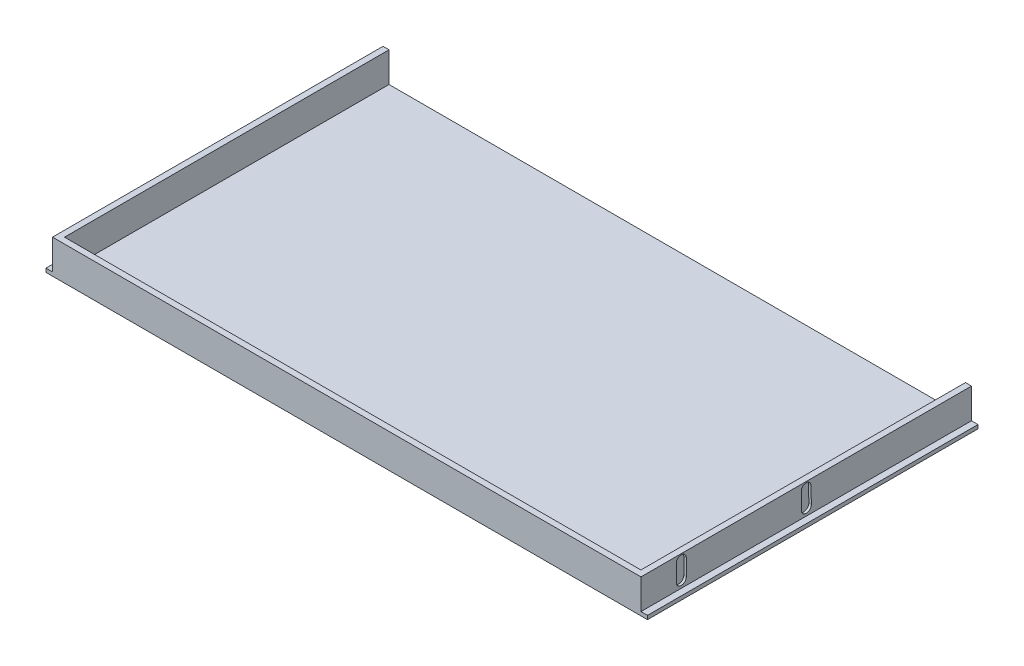
ISO-10303-21;
HEADER;
FILE_DESCRIPTION(('STEP AP214'),'2;1');
FILE_NAME('part.step','',(''),(''),'','','');
FILE_SCHEMA(('AUTOMOTIVE_DESIGN { 1 0 10303 214 1 1 1 1 }'));
ENDSEC;
DATA;
#1=APPLICATION_CONTEXT('core data for automotive mechanical design processes');
#2=APPLICATION_PROTOCOL_DEFINITION('international standard','automotive_design',2000,#1);
#3=PRODUCT_CONTEXT('',#1,'mechanical');
#4=PRODUCT('Part','Part','',(#3));
#5=PRODUCT_RELATED_PRODUCT_CATEGORY('part','',(#4));
#6=PRODUCT_DEFINITION_FORMATION('','',#4);
#7=PRODUCT_DEFINITION_CONTEXT('part definition',#1,'design');
#8=PRODUCT_DEFINITION('design','',#6,#7);
#9=PRODUCT_DEFINITION_SHAPE('','',#8);
#10=(LENGTH_UNIT() NAMED_UNIT(*) SI_UNIT(.MILLI.,.METRE.));
#11=(NAMED_UNIT(*) PLANE_ANGLE_UNIT() SI_UNIT($,.RADIAN.));
#12=(NAMED_UNIT(*) SI_UNIT($,.STERADIAN.) SOLID_ANGLE_UNIT());
#13=UNCERTAINTY_MEASURE_WITH_UNIT(LENGTH_MEASURE(1.E-05),#10,'distance_accuracy_value','');
#14=(GEOMETRIC_REPRESENTATION_CONTEXT(3) GLOBAL_UNCERTAINTY_ASSIGNED_CONTEXT((#13)) GLOBAL_UNIT_ASSIGNED_CONTEXT((#10,
#11,#12)) REPRESENTATION_CONTEXT('',''));
#15=CARTESIAN_POINT('',(0.,0.,0.));
#16=DIRECTION('',(0.,0.,1.));
#17=DIRECTION('',(1.,0.,0.));
#18=AXIS2_PLACEMENT_3D('',#15,#16,#17);
#19=CARTESIAN_POINT('',(-98.176553254438,21.,77.3984467455621));
#20=DIRECTION('',(1.,0.,0.));
#21=DIRECTION('',(0.,0.,-1.));
#22=AXIS2_PLACEMENT_3D('',#19,#20,#21);
#23=PLANE('',#22);
#24=DIRECTION('',(0.,-1.,0.));
#25=VECTOR('',#24,1.);
#26=CARTESIAN_POINT('',(-98.176553254438,21.,77.3984467455621));
#27=LINE('',#26,#25);
#28=CARTESIAN_POINT('',(-98.176553254438,1.5,77.3984467455621));
#29=VERTEX_POINT('',#28);
#30=CARTESIAN_POINT('',(-98.176553254438,0.,77.3984467455621));
#31=VERTEX_POINT('',#30);
#32=EDGE_CURVE('E42',#29,#31,#27,.T.);
#33=ORIENTED_EDGE('',*,*,#32,.F.);
#34=DIRECTION('',(0.,0.,1.));
#35=VECTOR('',#34,1.);
#36=CARTESIAN_POINT('',(-98.176553254438,1.5,77.3984467455621));
#37=LINE('',#36,#35);
#38=CARTESIAN_POINT('',(-98.176553254438,1.5,-54.4815532544379));
#39=VERTEX_POINT('',#38);
#40=EDGE_CURVE('E383',#39,#29,#37,.T.);
#41=ORIENTED_EDGE('',*,*,#40,.F.);
#42=DIRECTION('',(0.,-1.,0.));
#43=VECTOR('',#42,1.);
#44=CARTESIAN_POINT('',(-98.176553254438,21.,-54.4815532544379));
#45=LINE('',#44,#43);
#46=CARTESIAN_POINT('',(-98.176553254438,0.,-54.4815532544379));
#47=VERTEX_POINT('',#46);
#48=EDGE_CURVE('E419',#39,#47,#45,.T.);
#49=ORIENTED_EDGE('',*,*,#48,.T.);
#50=DIRECTION('',(0.,0.,1.));
#51=VECTOR('',#50,1.);
#52=CARTESIAN_POINT('',(-98.176553254438,0.,77.3984467455621));
#53=LINE('',#52,#51);
#54=EDGE_CURVE('E421',#47,#31,#53,.T.);
#55=ORIENTED_EDGE('',*,*,#54,.T.);
#56=EDGE_LOOP('',(#33,#41,#49,#55));
#57=FACE_BOUND('',#56,.T.);
#58=ADVANCED_FACE('F35',(#57),#23,.F.);
#59=CARTESIAN_POINT('',(-98.176553254438,21.,77.3984467455621));
#60=DIRECTION('',(0.,0.,-1.));
#61=DIRECTION('',(-1.,0.,0.));
#62=AXIS2_PLACEMENT_3D('',#59,#60,#61);
#63=PLANE('',#62);
#64=DIRECTION('',(1.,0.,0.));
#65=VECTOR('',#64,1.);
#66=CARTESIAN_POINT('',(139.223446745562,1.5,77.3984467455622));
#67=LINE('',#66,#65);
#68=CARTESIAN_POINT('',(139.223446745562,1.5,77.3984467455622));
#69=VERTEX_POINT('',#68);
#70=CARTESIAN_POINT('',(141.823446745562,1.5,77.3984467455622));
#71=VERTEX_POINT('',#70);
#72=EDGE_CURVE('E366',#69,#71,#67,.T.);
#73=ORIENTED_EDGE('',*,*,#72,.F.);
#74=DIRECTION('',(0.,1.,0.));
#75=VECTOR('',#74,1.);
#76=CARTESIAN_POINT('',(139.223446745562,1.5,77.3984467455622));
#77=LINE('',#76,#75);
#78=CARTESIAN_POINT('',(139.223446745562,13.5,77.3984467455622));
#79=VERTEX_POINT('',#78);
#80=EDGE_CURVE('E373',#69,#79,#77,.T.);
#81=ORIENTED_EDGE('',*,*,#80,.T.);
#82=DIRECTION('',(-1.,0.,0.));
#83=VECTOR('',#82,1.);
#84=CARTESIAN_POINT('',(-98.176553254438,13.5,77.3984467455621));
#85=LINE('',#84,#83);
#86=CARTESIAN_POINT('',(-95.576553254438,13.5,77.3984467455621));
#87=VERTEX_POINT('',#86);
#88=EDGE_CURVE('E394',#79,#87,#85,.T.);
#89=ORIENTED_EDGE('',*,*,#88,.T.);
#90=DIRECTION('',(0.,1.,0.));
#91=VECTOR('',#90,1.);
#92=CARTESIAN_POINT('',(-95.576553254438,1.5,77.3984467455621));
#93=LINE('',#92,#91);
#94=CARTESIAN_POINT('',(-95.576553254438,1.5,77.3984467455621));
#95=VERTEX_POINT('',#94);
#96=EDGE_CURVE('E372',#95,#87,#93,.T.);
#97=ORIENTED_EDGE('',*,*,#96,.F.);
#98=DIRECTION('',(1.,0.,0.));
#99=VECTOR('',#98,1.);
#100=CARTESIAN_POINT('',(-95.576553254438,1.5,77.3984467455621));
#101=LINE('',#100,#99);
#102=EDGE_CURVE('E385',#29,#95,#101,.T.);
#103=ORIENTED_EDGE('',*,*,#102,.F.);
#104=ORIENTED_EDGE('',*,*,#32,.T.);
#105=DIRECTION('',(1.,0.,0.));
#106=VECTOR('',#105,1.);
#107=CARTESIAN_POINT('',(-98.176553254438,0.,77.3984467455621));
#108=LINE('',#107,#106);
#109=CARTESIAN_POINT('',(141.823446745562,0.,77.3984467455622));
#110=VERTEX_POINT('',#109);
#111=EDGE_CURVE('E424',#31,#110,#108,.T.);
#112=ORIENTED_EDGE('',*,*,#111,.T.);
#113=DIRECTION('',(0.,-1.,0.));
#114=VECTOR('',#113,1.);
#115=CARTESIAN_POINT('',(141.823446745562,21.,77.3984467455622));
#116=LINE('',#115,#114);
#117=EDGE_CURVE('E430',#71,#110,#116,.T.);
#118=ORIENTED_EDGE('',*,*,#117,.F.);
#119=EDGE_LOOP('',(#73,#81,#89,#97,#103,#104,#112,#118));
#120=FACE_BOUND('',#119,.T.);
#121=ADVANCED_FACE('F435',(#120),#63,.F.);
#122=CARTESIAN_POINT('',(141.823446745562,21.,77.3984467455622));
#123=DIRECTION('',(-1.,0.,0.));
#124=DIRECTION('',(0.,0.,1.));
#125=AXIS2_PLACEMENT_3D('',#122,#123,#124);
#126=PLANE('',#125);
#127=DIRECTION('',(0.,1.,0.));
#128=VECTOR('',#127,1.);
#129=CARTESIAN_POINT('',(141.823446745562,21.,-54.4815532544379));
#130=LINE('',#129,#128);
#131=CARTESIAN_POINT('',(141.823446745562,0.,-54.4815532544379));
#132=VERTEX_POINT('',#131);
#133=CARTESIAN_POINT('',(141.823446745562,1.5,-54.4815532544379));
#134=VERTEX_POINT('',#133);
#135=EDGE_CURVE('E416',#132,#134,#130,.T.);
#136=ORIENTED_EDGE('',*,*,#135,.T.);
#137=DIRECTION('',(0.,0.,-1.));
#138=VECTOR('',#137,1.);
#139=CARTESIAN_POINT('',(141.823446745562,1.5,-54.4815532544379));
#140=LINE('',#139,#138);
#141=EDGE_CURVE('E368',#71,#134,#140,.T.);
#142=ORIENTED_EDGE('',*,*,#141,.F.);
#143=ORIENTED_EDGE('',*,*,#117,.T.);
#144=DIRECTION('',(0.,0.,-1.));
#145=VECTOR('',#144,1.);
#146=CARTESIAN_POINT('',(141.823446745562,0.,77.3984467455622));
#147=LINE('',#146,#145);
#148=EDGE_CURVE('E427',#110,#132,#147,.T.);
#149=ORIENTED_EDGE('',*,*,#148,.T.);
#150=EDGE_LOOP('',(#136,#142,#143,#149));
#151=FACE_BOUND('',#150,.T.);
#152=ADVANCED_FACE('F448',(#151),#126,.F.);
#153=CARTESIAN_POINT('',(0.,0.,0.));
#154=DIRECTION('',(0.,-1.,0.));
#155=DIRECTION('',(0.,0.,-1.));
#156=AXIS2_PLACEMENT_3D('',#153,#154,#155);
#157=PLANE('',#156);
#158=DIRECTION('',(-1.,0.,0.));
#159=VECTOR('',#158,1.);
#160=CARTESIAN_POINT('',(0.,0.,-54.4815532544379));
#161=LINE('',#160,#159);
#162=EDGE_CURVE('E11',#132,#47,#161,.T.);
#163=ORIENTED_EDGE('',*,*,#162,.F.);
#164=ORIENTED_EDGE('',*,*,#148,.F.);
#165=ORIENTED_EDGE('',*,*,#111,.F.);
#166=ORIENTED_EDGE('',*,*,#54,.F.);
#167=EDGE_LOOP('',(#163,#164,#165,#166));
#168=FACE_BOUND('',#167,.T.);
#169=ADVANCED_FACE('F446',(#168),#157,.T.);
#170=CARTESIAN_POINT('',(0.,0.,-54.4815532544379));
#171=DIRECTION('',(0.,0.,1.));
#172=DIRECTION('',(1.,0.,0.));
#173=AXIS2_PLACEMENT_3D('',#170,#171,#172);
#174=PLANE('',#173);
#175=DIRECTION('',(0.,-1.,0.));
#176=VECTOR('',#175,1.);
#177=CARTESIAN_POINT('',(-93.176553254438,13.5,-54.4815532544379));
#178=LINE('',#177,#176);
#179=CARTESIAN_POINT('',(-93.176553254438,13.5,-54.4815532544379));
#180=VERTEX_POINT('',#179);
#181=CARTESIAN_POINT('',(-93.176553254438,1.5,-54.4815532544379));
#182=VERTEX_POINT('',#181);
#183=EDGE_CURVE('E411',#180,#182,#178,.T.);
#184=ORIENTED_EDGE('',*,*,#183,.T.);
#185=DIRECTION('',(-1.,0.,0.));
#186=VECTOR('',#185,1.);
#187=CARTESIAN_POINT('',(-93.176553254438,1.5,-54.4815532544379));
#188=LINE('',#187,#186);
#189=CARTESIAN_POINT('',(136.823446745562,1.5,-54.4815532544379));
#190=VERTEX_POINT('',#189);
#191=EDGE_CURVE('E356',#190,#182,#188,.T.);
#192=ORIENTED_EDGE('',*,*,#191,.F.);
#193=DIRECTION('',(0.,1.,0.));
#194=VECTOR('',#193,1.);
#195=CARTESIAN_POINT('',(136.823446745562,5.,-54.4815532544379));
#196=LINE('',#195,#194);
#197=CARTESIAN_POINT('',(136.823446745562,13.5,-54.4815532544379));
#198=VERTEX_POINT('',#197);
#199=EDGE_CURVE('E398',#190,#198,#196,.T.);
#200=ORIENTED_EDGE('',*,*,#199,.T.);
#201=DIRECTION('',(1.,0.,0.));
#202=VECTOR('',#201,1.);
#203=CARTESIAN_POINT('',(0.,13.5,-54.4815532544379));
#204=LINE('',#203,#202);
#205=CARTESIAN_POINT('',(139.223446745562,13.5,-54.4815532544379));
#206=VERTEX_POINT('',#205);
#207=EDGE_CURVE('E395',#198,#206,#204,.T.);
#208=ORIENTED_EDGE('',*,*,#207,.T.);
#209=DIRECTION('',(0.,1.,0.));
#210=VECTOR('',#209,1.);
#211=CARTESIAN_POINT('',(139.223446745562,1.5,-54.4815532544379));
#212=LINE('',#211,#210);
#213=CARTESIAN_POINT('',(139.223446745562,1.5,-54.4815532544379));
#214=VERTEX_POINT('',#213);
#215=EDGE_CURVE('E370',#214,#206,#212,.T.);
#216=ORIENTED_EDGE('',*,*,#215,.F.);
#217=DIRECTION('',(-1.,0.,0.));
#218=VECTOR('',#217,1.);
#219=CARTESIAN_POINT('',(139.223446745562,1.5,-54.4815532544379));
#220=LINE('',#219,#218);
#221=EDGE_CURVE('E360',#134,#214,#220,.T.);
#222=ORIENTED_EDGE('',*,*,#221,.F.);
#223=ORIENTED_EDGE('',*,*,#135,.F.);
#224=ORIENTED_EDGE('',*,*,#162,.T.);
#225=ORIENTED_EDGE('',*,*,#48,.F.);
#226=DIRECTION('',(-1.,0.,0.));
#227=VECTOR('',#226,1.);
#228=CARTESIAN_POINT('',(-98.176553254438,1.5,-54.4815532544379));
#229=LINE('',#228,#227);
#230=CARTESIAN_POINT('',(-95.576553254438,1.5,-54.4815532544379));
#231=VERTEX_POINT('',#230);
#232=EDGE_CURVE('E381',#231,#39,#229,.T.);
#233=ORIENTED_EDGE('',*,*,#232,.F.);
#234=DIRECTION('',(0.,1.,0.));
#235=VECTOR('',#234,1.);
#236=CARTESIAN_POINT('',(-95.576553254438,1.5,-54.4815532544379));
#237=LINE('',#236,#235);
#238=CARTESIAN_POINT('',(-95.576553254438,13.5,-54.4815532544379));
#239=VERTEX_POINT('',#238);
#240=EDGE_CURVE('E388',#231,#239,#237,.T.);
#241=ORIENTED_EDGE('',*,*,#240,.T.);
#242=EDGE_CURVE('E376',#239,#180,#204,.T.);
#243=ORIENTED_EDGE('',*,*,#242,.T.);
#244=EDGE_LOOP('',(#184,#192,#200,#208,#216,#222,#223,#224,#225,#233,#241,#243));
#245=FACE_BOUND('',#244,.T.);
#246=ADVANCED_FACE('F465',(#245),#174,.F.);
#247=CARTESIAN_POINT('',(0.,0.,75.0184467455621));
#248=DIRECTION('',(0.,0.,-1.));
#249=DIRECTION('',(-1.,0.,0.));
#250=AXIS2_PLACEMENT_3D('',#247,#248,#249);
#251=PLANE('',#250);
#252=DIRECTION('',(0.,-1.,0.));
#253=VECTOR('',#252,1.);
#254=CARTESIAN_POINT('',(136.823446745562,13.5,75.0184467455621));
#255=LINE('',#254,#253);
#256=CARTESIAN_POINT('',(136.823446745562,13.5,75.0184467455621));
#257=VERTEX_POINT('',#256);
#258=CARTESIAN_POINT('',(136.823446745562,1.5,75.0184467455621));
#259=VERTEX_POINT('',#258);
#260=EDGE_CURVE('E403',#257,#259,#255,.T.);
#261=ORIENTED_EDGE('',*,*,#260,.T.);
#262=DIRECTION('',(1.,0.,0.));
#263=VECTOR('',#262,1.);
#264=CARTESIAN_POINT('',(136.823446745562,1.5,75.0184467455621));
#265=LINE('',#264,#263);
#266=CARTESIAN_POINT('',(-93.176553254438,1.5,75.0184467455621));
#267=VERTEX_POINT('',#266);
#268=EDGE_CURVE('E350',#267,#259,#265,.T.);
#269=ORIENTED_EDGE('',*,*,#268,.F.);
#270=DIRECTION('',(0.,1.,0.));
#271=VECTOR('',#270,1.);
#272=CARTESIAN_POINT('',(-93.176553254438,5.,75.0184467455621));
#273=LINE('',#272,#271);
#274=CARTESIAN_POINT('',(-93.1765532544381,13.5,75.0184467455621));
#275=VERTEX_POINT('',#274);
#276=EDGE_CURVE('E405',#267,#275,#273,.T.);
#277=ORIENTED_EDGE('',*,*,#276,.T.);
#278=DIRECTION('',(1.,0.,0.));
#279=VECTOR('',#278,1.);
#280=CARTESIAN_POINT('',(-98.176553254438,13.5,75.0184467455621));
#281=LINE('',#280,#279);
#282=EDGE_CURVE('E413',#275,#257,#281,.T.);
#283=ORIENTED_EDGE('',*,*,#282,.T.);
#284=EDGE_LOOP('',(#261,#269,#277,#283));
#285=FACE_BOUND('',#284,.T.);
#286=ADVANCED_FACE('F476',(#285),#251,.T.);
#287=CARTESIAN_POINT('',(-93.176553254438,0.,129.5));
#288=DIRECTION('',(-1.,0.,0.));
#289=DIRECTION('',(0.,0.,1.));
#290=AXIS2_PLACEMENT_3D('',#287,#288,#289);
#291=PLANE('',#290);
#292=ORIENTED_EDGE('',*,*,#183,.F.);
#293=DIRECTION('',(0.,0.,-1.));
#294=VECTOR('',#293,1.);
#295=CARTESIAN_POINT('',(-93.176553254438,13.5,75.0184467455621));
#296=LINE('',#295,#294);
#297=EDGE_CURVE('E408',#275,#180,#296,.T.);
#298=ORIENTED_EDGE('',*,*,#297,.F.);
#299=ORIENTED_EDGE('',*,*,#276,.F.);
#300=DIRECTION('',(0.,0.,1.));
#301=VECTOR('',#300,1.);
#302=CARTESIAN_POINT('',(-93.176553254438,1.5,75.0184467455621));
#303=LINE('',#302,#301);
#304=EDGE_CURVE('E341',#182,#267,#303,.T.);
#305=ORIENTED_EDGE('',*,*,#304,.F.);
#306=EDGE_LOOP('',(#292,#298,#299,#305));
#307=FACE_BOUND('',#306,.T.);
#308=ADVANCED_FACE('F481',(#307),#291,.F.);
#309=CARTESIAN_POINT('',(136.823446745562,0.,129.5));
#310=DIRECTION('',(1.,0.,0.));
#311=DIRECTION('',(0.,0.,-1.));
#312=AXIS2_PLACEMENT_3D('',#309,#310,#311);
#313=PLANE('',#312);
#314=ORIENTED_EDGE('',*,*,#260,.F.);
#315=DIRECTION('',(0.,0.,1.));
#316=VECTOR('',#315,1.);
#317=CARTESIAN_POINT('',(136.823446745562,13.5,-54.4815532544379));
#318=LINE('',#317,#316);
#319=EDGE_CURVE('E401',#198,#257,#318,.T.);
#320=ORIENTED_EDGE('',*,*,#319,.F.);
#321=ORIENTED_EDGE('',*,*,#199,.F.);
#322=DIRECTION('',(0.,0.,-1.));
#323=VECTOR('',#322,1.);
#324=CARTESIAN_POINT('',(136.823446745562,1.5,-54.4815532544379));
#325=LINE('',#324,#323);
#326=EDGE_CURVE('E353',#259,#190,#325,.T.);
#327=ORIENTED_EDGE('',*,*,#326,.F.);
#328=EDGE_LOOP('',(#314,#320,#321,#327));
#329=FACE_BOUND('',#328,.T.);
#330=ADVANCED_FACE('F470',(#329),#313,.F.);
#331=CARTESIAN_POINT('',(0.,13.5,0.));
#332=DIRECTION('',(0.,-1.,0.));
#333=DIRECTION('',(0.,0.,-1.));
#334=AXIS2_PLACEMENT_3D('',#331,#332,#333);
#335=PLANE('',#334);
#336=ORIENTED_EDGE('',*,*,#88,.F.);
#337=DIRECTION('',(0.,0.,1.));
#338=VECTOR('',#337,1.);
#339=CARTESIAN_POINT('',(139.223446745562,13.5,75.7184467455621));
#340=LINE('',#339,#338);
#341=EDGE_CURVE('E364',#206,#79,#340,.T.);
#342=ORIENTED_EDGE('',*,*,#341,.F.);
#343=ORIENTED_EDGE('',*,*,#207,.F.);
#344=ORIENTED_EDGE('',*,*,#319,.T.);
#345=ORIENTED_EDGE('',*,*,#282,.F.);
#346=ORIENTED_EDGE('',*,*,#297,.T.);
#347=ORIENTED_EDGE('',*,*,#242,.F.);
#348=DIRECTION('',(0.,0.,-1.));
#349=VECTOR('',#348,1.);
#350=CARTESIAN_POINT('',(-95.576553254438,13.5,75.7184467455622));
#351=LINE('',#350,#349);
#352=EDGE_CURVE('E359',#87,#239,#351,.T.);
#353=ORIENTED_EDGE('',*,*,#352,.F.);
#354=EDGE_LOOP('',(#336,#342,#343,#344,#345,#346,#347,#353));
#355=FACE_BOUND('',#354,.T.);
#356=ADVANCED_FACE('F462',(#355),#335,.F.);
#357=CARTESIAN_POINT('',(-95.576553254438,1.5,75.7184467455622));
#358=DIRECTION('',(1.,0.,0.));
#359=DIRECTION('',(0.,0.,-1.));
#360=AXIS2_PLACEMENT_3D('',#357,#358,#359);
#361=PLANE('',#360);
#362=DIRECTION('',(0.,1.,0.));
#363=VECTOR('',#362,1.);
#364=CARTESIAN_POINT('',(-95.576553254438,4.5,63.3184467455621));
#365=LINE('',#364,#363);
#366=CARTESIAN_POINT('',(-95.576553254438,4.5,63.3184467455621));
#367=VERTEX_POINT('',#366);
#368=CARTESIAN_POINT('',(-95.576553254438,11.09,63.3184467455621));
#369=VERTEX_POINT('',#368);
#370=EDGE_CURVE('E247',#367,#369,#365,.T.);
#371=ORIENTED_EDGE('',*,*,#370,.F.);
#372=CARTESIAN_POINT('',(-95.576553254438,4.5,61.3184467455621));
#373=DIRECTION('',(-1.,0.,0.));
#374=DIRECTION('',(0.,0.,1.));
#375=AXIS2_PLACEMENT_3D('',#372,#373,#374);
#376=CIRCLE('',#375,1.99999999999998);
#377=CARTESIAN_POINT('',(-95.576553254438,4.5,59.3184467455621));
#378=VERTEX_POINT('',#377);
#379=EDGE_CURVE('E49',#378,#367,#376,.T.);
#380=ORIENTED_EDGE('',*,*,#379,.F.);
#381=DIRECTION('',(0.,1.,0.));
#382=VECTOR('',#381,1.);
#383=CARTESIAN_POINT('',(-95.576553254438,4.5,59.3184467455621));
#384=LINE('',#383,#382);
#385=CARTESIAN_POINT('',(-95.576553254438,11.09,59.3184467455621));
#386=VERTEX_POINT('',#385);
#387=EDGE_CURVE('E238',#378,#386,#384,.T.);
#388=ORIENTED_EDGE('',*,*,#387,.T.);
#389=CARTESIAN_POINT('',(-95.576553254438,11.09,61.3184467455621));
#390=DIRECTION('',(-1.,0.,0.));
#391=DIRECTION('',(0.,0.,1.));
#392=AXIS2_PLACEMENT_3D('',#389,#390,#391);
#393=CIRCLE('',#392,1.99999999999999);
#394=EDGE_CURVE('E241',#369,#386,#393,.T.);
#395=ORIENTED_EDGE('',*,*,#394,.F.);
#396=EDGE_LOOP('',(#371,#380,#388,#395));
#397=FACE_BOUND('',#396,.T.);
#398=DIRECTION('',(0.,1.,0.));
#399=VECTOR('',#398,1.);
#400=CARTESIAN_POINT('',(-95.576553254438,4.5,13.4184467455621));
#401=LINE('',#400,#399);
#402=CARTESIAN_POINT('',(-95.576553254438,4.5,13.4184467455621));
#403=VERTEX_POINT('',#402);
#404=CARTESIAN_POINT('',(-95.576553254438,11.0906498137645,13.4184467455621));
#405=VERTEX_POINT('',#404);
#406=EDGE_CURVE('E331',#403,#405,#401,.T.);
#407=ORIENTED_EDGE('',*,*,#406,.F.);
#408=CARTESIAN_POINT('',(-95.576553254438,4.5,11.4184467455621));
#409=DIRECTION('',(-1.,0.,0.));
#410=DIRECTION('',(0.,0.,1.));
#411=AXIS2_PLACEMENT_3D('',#408,#409,#410);
#412=CIRCLE('',#411,2.);
#413=CARTESIAN_POINT('',(-95.576553254438,4.5,9.41844674556213));
#414=VERTEX_POINT('',#413);
#415=EDGE_CURVE('E309',#414,#403,#412,.T.);
#416=ORIENTED_EDGE('',*,*,#415,.F.);
#417=DIRECTION('',(0.,-0.9998651356836,-0.0164228634657954));
#418=VECTOR('',#417,1.);
#419=CARTESIAN_POINT('',(-95.576553254438,4.5,9.41844674556213));
#420=LINE('',#419,#418);
#421=CARTESIAN_POINT('',(-95.576553254438,11.0906498137645,9.52669868692852));
#422=VERTEX_POINT('',#421);
#423=EDGE_CURVE('E320',#422,#414,#420,.T.);
#424=ORIENTED_EDGE('',*,*,#423,.F.);
#425=CARTESIAN_POINT('',(-95.576553254438,11.0906498137645,11.4725727162453));
#426=DIRECTION('',(-1.,0.,0.));
#427=DIRECTION('',(0.,0.,1.));
#428=AXIS2_PLACEMENT_3D('',#425,#426,#427);
#429=CIRCLE('',#428,1.9458740293168);
#430=EDGE_CURVE('E334',#405,#422,#429,.T.);
#431=ORIENTED_EDGE('',*,*,#430,.F.);
#432=EDGE_LOOP('',(#407,#416,#424,#431));
#433=FACE_BOUND('',#432,.T.);
#434=ORIENTED_EDGE('',*,*,#352,.T.);
#435=ORIENTED_EDGE('',*,*,#240,.F.);
#436=DIRECTION('',(0.,0.,-1.));
#437=VECTOR('',#436,1.);
#438=CARTESIAN_POINT('',(-95.576553254438,1.5,75.7184467455622));
#439=LINE('',#438,#437);
#440=EDGE_CURVE('E378',#95,#231,#439,.T.);
#441=ORIENTED_EDGE('',*,*,#440,.F.);
#442=ORIENTED_EDGE('',*,*,#96,.T.);
#443=EDGE_LOOP('',(#434,#435,#441,#442));
#444=FACE_BOUND('',#443,.T.);
#445=ADVANCED_FACE('F484',(#397,#433,#444),#361,.F.);
#446=CARTESIAN_POINT('',(0.,1.5,0.));
#447=DIRECTION('',(0.,-1.,0.));
#448=DIRECTION('',(0.,0.,-1.));
#449=AXIS2_PLACEMENT_3D('',#446,#447,#448);
#450=PLANE('',#449);
#451=ORIENTED_EDGE('',*,*,#440,.T.);
#452=ORIENTED_EDGE('',*,*,#232,.T.);
#453=ORIENTED_EDGE('',*,*,#40,.T.);
#454=ORIENTED_EDGE('',*,*,#102,.T.);
#455=EDGE_LOOP('',(#451,#452,#453,#454));
#456=FACE_BOUND('',#455,.T.);
#457=ADVANCED_FACE('F486',(#456),#450,.F.);
#458=CARTESIAN_POINT('',(139.223446745562,1.5,75.7184467455621));
#459=DIRECTION('',(-1.,0.,0.));
#460=DIRECTION('',(0.,0.,1.));
#461=AXIS2_PLACEMENT_3D('',#458,#459,#460);
#462=PLANE('',#461);
#463=DIRECTION('',(0.,1.,0.));
#464=VECTOR('',#463,1.);
#465=CARTESIAN_POINT('',(139.223446745562,4.5,59.3184467455621));
#466=LINE('',#465,#464);
#467=CARTESIAN_POINT('',(139.223446745562,4.5,59.3184467455621));
#468=VERTEX_POINT('',#467);
#469=CARTESIAN_POINT('',(139.223446745562,11.09,59.3184467455621));
#470=VERTEX_POINT('',#469);
#471=EDGE_CURVE('E270',#468,#470,#466,.T.);
#472=ORIENTED_EDGE('',*,*,#471,.F.);
#473=CARTESIAN_POINT('',(139.223446745562,4.5,61.3184467455621));
#474=DIRECTION('',(1.,0.,0.));
#475=DIRECTION('',(0.,0.,-1.));
#476=AXIS2_PLACEMENT_3D('',#473,#474,#475);
#477=CIRCLE('',#476,1.99999999999999);
#478=CARTESIAN_POINT('',(139.223446745562,4.5,63.3184467455621));
#479=VERTEX_POINT('',#478);
#480=EDGE_CURVE('E57',#479,#468,#477,.T.);
#481=ORIENTED_EDGE('',*,*,#480,.F.);
#482=DIRECTION('',(0.,1.,0.));
#483=VECTOR('',#482,1.);
#484=CARTESIAN_POINT('',(139.223446745562,4.5,63.3184467455621));
#485=LINE('',#484,#483);
#486=CARTESIAN_POINT('',(139.223446745562,11.09,63.3184467455621));
#487=VERTEX_POINT('',#486);
#488=EDGE_CURVE('E260',#479,#487,#485,.T.);
#489=ORIENTED_EDGE('',*,*,#488,.T.);
#490=CARTESIAN_POINT('',(139.223446745562,11.09,61.3184467455621));
#491=DIRECTION('',(1.,0.,0.));
#492=DIRECTION('',(0.,0.,-1.));
#493=AXIS2_PLACEMENT_3D('',#490,#491,#492);
#494=CIRCLE('',#493,1.99999999999999);
#495=EDGE_CURVE('E273',#470,#487,#494,.T.);
#496=ORIENTED_EDGE('',*,*,#495,.F.);
#497=EDGE_LOOP('',(#472,#481,#489,#496));
#498=FACE_BOUND('',#497,.T.);
#499=DIRECTION('',(0.,0.9998651356836,0.0164228634657954));
#500=VECTOR('',#499,1.);
#501=CARTESIAN_POINT('',(139.223446745562,4.5,9.41844674556213));
#502=LINE('',#501,#500);
#503=CARTESIAN_POINT('',(139.223446745562,4.5,9.41844674556212));
#504=VERTEX_POINT('',#503);
#505=CARTESIAN_POINT('',(139.223446745562,11.0906498137645,9.52669868692852));
#506=VERTEX_POINT('',#505);
#507=EDGE_CURVE('E299',#504,#506,#502,.T.);
#508=ORIENTED_EDGE('',*,*,#507,.F.);
#509=CARTESIAN_POINT('',(139.223446745562,4.5,11.4184467455621));
#510=DIRECTION('',(1.,0.,0.));
#511=DIRECTION('',(0.,0.,-1.));
#512=AXIS2_PLACEMENT_3D('',#509,#510,#511);
#513=CIRCLE('',#512,2.);
#514=CARTESIAN_POINT('',(139.223446745562,4.5,13.4184467455621));
#515=VERTEX_POINT('',#514);
#516=EDGE_CURVE('E280',#515,#504,#513,.T.);
#517=ORIENTED_EDGE('',*,*,#516,.F.);
#518=DIRECTION('',(0.,1.,0.));
#519=VECTOR('',#518,1.);
#520=CARTESIAN_POINT('',(139.223446745562,4.5,13.4184467455621));
#521=LINE('',#520,#519);
#522=CARTESIAN_POINT('',(139.223446745562,11.0906498137645,13.4184467455621));
#523=VERTEX_POINT('',#522);
#524=EDGE_CURVE('E290',#515,#523,#521,.T.);
#525=ORIENTED_EDGE('',*,*,#524,.T.);
#526=CARTESIAN_POINT('',(139.223446745562,11.0906498137645,11.4725727162453));
#527=DIRECTION('',(-1.,0.,0.));
#528=DIRECTION('',(0.,0.,1.));
#529=AXIS2_PLACEMENT_3D('',#526,#527,#528);
#530=CIRCLE('',#529,1.9458740293168);
#531=EDGE_CURVE('E302',#523,#506,#530,.T.);
#532=ORIENTED_EDGE('',*,*,#531,.T.);
#533=EDGE_LOOP('',(#508,#517,#525,#532));
#534=FACE_BOUND('',#533,.T.);
#535=ORIENTED_EDGE('',*,*,#341,.T.);
#536=ORIENTED_EDGE('',*,*,#80,.F.);
#537=DIRECTION('',(0.,0.,1.));
#538=VECTOR('',#537,1.);
#539=CARTESIAN_POINT('',(139.223446745562,1.5,-54.4815532544379));
#540=LINE('',#539,#538);
#541=EDGE_CURVE('E363',#214,#69,#540,.T.);
#542=ORIENTED_EDGE('',*,*,#541,.F.);
#543=ORIENTED_EDGE('',*,*,#215,.T.);
#544=EDGE_LOOP('',(#535,#536,#542,#543));
#545=FACE_BOUND('',#544,.T.);
#546=ADVANCED_FACE('F457',(#498,#534,#545),#462,.F.);
#547=CARTESIAN_POINT('',(0.,1.5,0.));
#548=DIRECTION('',(0.,-1.,0.));
#549=DIRECTION('',(0.,0.,-1.));
#550=AXIS2_PLACEMENT_3D('',#547,#548,#549);
#551=PLANE('',#550);
#552=ORIENTED_EDGE('',*,*,#221,.T.);
#553=ORIENTED_EDGE('',*,*,#541,.T.);
#554=ORIENTED_EDGE('',*,*,#72,.T.);
#555=ORIENTED_EDGE('',*,*,#141,.T.);
#556=EDGE_LOOP('',(#552,#553,#554,#555));
#557=FACE_BOUND('',#556,.T.);
#558=ADVANCED_FACE('F453',(#557),#551,.F.);
#559=CARTESIAN_POINT('',(0.,1.5,0.));
#560=DIRECTION('',(0.,-1.,0.));
#561=DIRECTION('',(0.,0.,-1.));
#562=AXIS2_PLACEMENT_3D('',#559,#560,#561);
#563=PLANE('',#562);
#564=ORIENTED_EDGE('',*,*,#304,.T.);
#565=ORIENTED_EDGE('',*,*,#268,.T.);
#566=ORIENTED_EDGE('',*,*,#326,.T.);
#567=ORIENTED_EDGE('',*,*,#191,.T.);
#568=EDGE_LOOP('',(#564,#565,#566,#567));
#569=FACE_BOUND('',#568,.T.);
#570=ADVANCED_FACE('F472',(#569),#563,.F.);
#571=CARTESIAN_POINT('',(-94.576553254438,4.5,11.4184467455621));
#572=DIRECTION('',(-1.,0.,0.));
#573=DIRECTION('',(0.,0.,1.));
#574=AXIS2_PLACEMENT_3D('',#571,#572,#573);
#575=CYLINDRICAL_SURFACE('',#574,2.);
#576=ORIENTED_EDGE('',*,*,#415,.T.);
#577=DIRECTION('',(-1.,0.,0.));
#578=VECTOR('',#577,1.);
#579=CARTESIAN_POINT('',(-94.576553254438,4.5,13.4184467455621));
#580=LINE('',#579,#578);
#581=CARTESIAN_POINT('',(-94.576553254438,4.5,13.4184467455621));
#582=VERTEX_POINT('',#581);
#583=EDGE_CURVE('E329',#582,#403,#580,.T.);
#584=ORIENTED_EDGE('',*,*,#583,.F.);
#585=CARTESIAN_POINT('',(-94.576553254438,4.5,11.4184467455621));
#586=DIRECTION('',(-1.,0.,0.));
#587=DIRECTION('',(0.,0.,1.));
#588=AXIS2_PLACEMENT_3D('',#585,#586,#587);
#589=CIRCLE('',#588,2.);
#590=CARTESIAN_POINT('',(-94.576553254438,4.5,9.41844674556213));
#591=VERTEX_POINT('',#590);
#592=EDGE_CURVE('E316',#591,#582,#589,.T.);
#593=ORIENTED_EDGE('',*,*,#592,.F.);
#594=DIRECTION('',(-1.,0.,0.));
#595=VECTOR('',#594,1.);
#596=CARTESIAN_POINT('',(-94.576553254438,4.5,9.41844674556213));
#597=LINE('',#596,#595);
#598=EDGE_CURVE('E339',#591,#414,#597,.T.);
#599=ORIENTED_EDGE('',*,*,#598,.T.);
#600=EDGE_LOOP('',(#576,#584,#593,#599));
#601=FACE_BOUND('',#600,.T.);
#602=ADVANCED_FACE('F630',(#601),#575,.F.);
#603=CARTESIAN_POINT('',(-94.576553254438,4.5,9.41844674556213));
#604=DIRECTION('',(0.,0.0164228634657954,-0.9998651356836));
#605=DIRECTION('',(0.,0.9998651356836,0.0164228634657954));
#606=AXIS2_PLACEMENT_3D('',#603,#604,#605);
#607=PLANE('',#606);
#608=ORIENTED_EDGE('',*,*,#423,.T.);
#609=ORIENTED_EDGE('',*,*,#598,.F.);
#610=DIRECTION('',(0.,-0.9998651356836,-0.0164228634657954));
#611=VECTOR('',#610,1.);
#612=CARTESIAN_POINT('',(-94.576553254438,4.5,9.41844674556213));
#613=LINE('',#612,#611);
#614=CARTESIAN_POINT('',(-94.576553254438,11.0906498137645,9.52669868692852));
#615=VERTEX_POINT('',#614);
#616=EDGE_CURVE('E326',#615,#591,#613,.T.);
#617=ORIENTED_EDGE('',*,*,#616,.F.);
#618=DIRECTION('',(-1.,0.,0.));
#619=VECTOR('',#618,1.);
#620=CARTESIAN_POINT('',(-94.576553254438,11.0906498137645,9.52669868692852));
#621=LINE('',#620,#619);
#622=EDGE_CURVE('E342',#615,#422,#621,.T.);
#623=ORIENTED_EDGE('',*,*,#622,.T.);
#624=EDGE_LOOP('',(#608,#609,#617,#623));
#625=FACE_BOUND('',#624,.T.);
#626=ADVANCED_FACE('F626',(#625),#607,.F.);
#627=CARTESIAN_POINT('',(-94.576553254438,11.0906498137645,11.4725727162453));
#628=DIRECTION('',(-1.,0.,0.));
#629=DIRECTION('',(0.,0.,1.));
#630=AXIS2_PLACEMENT_3D('',#627,#628,#629);
#631=CYLINDRICAL_SURFACE('',#630,1.9458740293168);
#632=ORIENTED_EDGE('',*,*,#430,.T.);
#633=ORIENTED_EDGE('',*,*,#622,.F.);
#634=CARTESIAN_POINT('',(-94.576553254438,11.0906498137645,11.4725727162453));
#635=DIRECTION('',(-1.,0.,0.));
#636=DIRECTION('',(0.,0.,1.));
#637=AXIS2_PLACEMENT_3D('',#634,#635,#636);
#638=CIRCLE('',#637,1.9458740293168);
#639=CARTESIAN_POINT('',(-94.576553254438,11.0906498137645,13.4184467455621));
#640=VERTEX_POINT('',#639);
#641=EDGE_CURVE('E323',#640,#615,#638,.T.);
#642=ORIENTED_EDGE('',*,*,#641,.F.);
#643=DIRECTION('',(-1.,0.,0.));
#644=VECTOR('',#643,1.);
#645=CARTESIAN_POINT('',(-94.576553254438,11.0906498137645,13.4184467455621));
#646=LINE('',#645,#644);
#647=EDGE_CURVE('E344',#640,#405,#646,.T.);
#648=ORIENTED_EDGE('',*,*,#647,.T.);
#649=EDGE_LOOP('',(#632,#633,#642,#648));
#650=FACE_BOUND('',#649,.T.);
#651=ADVANCED_FACE('F629',(#650),#631,.F.);
#652=CARTESIAN_POINT('',(-94.576553254438,4.5,13.4184467455621));
#653=DIRECTION('',(0.,0.,1.));
#654=DIRECTION('',(0.,-1.,0.));
#655=AXIS2_PLACEMENT_3D('',#652,#653,#654);
#656=PLANE('',#655);
#657=ORIENTED_EDGE('',*,*,#406,.T.);
#658=ORIENTED_EDGE('',*,*,#647,.F.);
#659=DIRECTION('',(0.,1.,0.));
#660=VECTOR('',#659,1.);
#661=CARTESIAN_POINT('',(-94.576553254438,4.5,13.4184467455621));
#662=LINE('',#661,#660);
#663=EDGE_CURVE('E319',#582,#640,#662,.T.);
#664=ORIENTED_EDGE('',*,*,#663,.F.);
#665=ORIENTED_EDGE('',*,*,#583,.T.);
#666=EDGE_LOOP('',(#657,#658,#664,#665));
#667=FACE_BOUND('',#666,.T.);
#668=ADVANCED_FACE('F624',(#667),#656,.F.);
#669=CARTESIAN_POINT('',(-94.576553254438,4.5,11.4184467455621));
#670=DIRECTION('',(-1.,0.,0.));
#671=DIRECTION('',(0.,0.,1.));
#672=AXIS2_PLACEMENT_3D('',#669,#670,#671);
#673=PLANE('',#672);
#674=ORIENTED_EDGE('',*,*,#592,.T.);
#675=ORIENTED_EDGE('',*,*,#663,.T.);
#676=ORIENTED_EDGE('',*,*,#641,.T.);
#677=ORIENTED_EDGE('',*,*,#616,.T.);
#678=EDGE_LOOP('',(#674,#675,#676,#677));
#679=FACE_BOUND('',#678,.T.);
#680=ADVANCED_FACE('F620',(#679),#673,.T.);
#681=CARTESIAN_POINT('',(138.223446745562,4.5,11.4184467455621));
#682=DIRECTION('',(1.,0.,0.));
#683=DIRECTION('',(0.,0.,-1.));
#684=AXIS2_PLACEMENT_3D('',#681,#682,#683);
#685=CYLINDRICAL_SURFACE('',#684,2.);
#686=ORIENTED_EDGE('',*,*,#516,.T.);
#687=DIRECTION('',(1.,0.,0.));
#688=VECTOR('',#687,1.);
#689=CARTESIAN_POINT('',(138.223446745562,4.5,9.41844674556213));
#690=LINE('',#689,#688);
#691=CARTESIAN_POINT('',(138.223446745562,4.5,9.41844674556213));
#692=VERTEX_POINT('',#691);
#693=EDGE_CURVE('E297',#692,#504,#690,.T.);
#694=ORIENTED_EDGE('',*,*,#693,.F.);
#695=CARTESIAN_POINT('',(138.223446745562,4.5,11.4184467455621));
#696=DIRECTION('',(1.,0.,0.));
#697=DIRECTION('',(0.,0.,-1.));
#698=AXIS2_PLACEMENT_3D('',#695,#696,#697);
#699=CIRCLE('',#698,2.);
#700=CARTESIAN_POINT('',(138.223446745562,4.5,13.4184467455621));
#701=VERTEX_POINT('',#700);
#702=EDGE_CURVE('E286',#701,#692,#699,.T.);
#703=ORIENTED_EDGE('',*,*,#702,.F.);
#704=DIRECTION('',(1.,0.,0.));
#705=VECTOR('',#704,1.);
#706=CARTESIAN_POINT('',(138.223446745562,4.5,13.4184467455621));
#707=LINE('',#706,#705);
#708=EDGE_CURVE('E307',#701,#515,#707,.T.);
#709=ORIENTED_EDGE('',*,*,#708,.T.);
#710=EDGE_LOOP('',(#686,#694,#703,#709));
#711=FACE_BOUND('',#710,.T.);
#712=ADVANCED_FACE('F610',(#711),#685,.F.);
#713=CARTESIAN_POINT('',(138.223446745562,4.5,13.4184467455621));
#714=DIRECTION('',(0.,0.,-1.));
#715=DIRECTION('',(-1.,0.,0.));
#716=AXIS2_PLACEMENT_3D('',#713,#714,#715);
#717=PLANE('',#716);
#718=ORIENTED_EDGE('',*,*,#524,.F.);
#719=ORIENTED_EDGE('',*,*,#708,.F.);
#720=DIRECTION('',(0.,1.,0.));
#721=VECTOR('',#720,1.);
#722=CARTESIAN_POINT('',(138.223446745562,4.5,13.4184467455621));
#723=LINE('',#722,#721);
#724=CARTESIAN_POINT('',(138.223446745562,11.0906498137645,13.4184467455621));
#725=VERTEX_POINT('',#724);
#726=EDGE_CURVE('E295',#701,#725,#723,.T.);
#727=ORIENTED_EDGE('',*,*,#726,.T.);
#728=DIRECTION('',(1.,0.,0.));
#729=VECTOR('',#728,1.);
#730=CARTESIAN_POINT('',(138.223446745562,11.0906498137645,13.4184467455621));
#731=LINE('',#730,#729);
#732=EDGE_CURVE('E310',#725,#523,#731,.T.);
#733=ORIENTED_EDGE('',*,*,#732,.T.);
#734=EDGE_LOOP('',(#718,#719,#727,#733));
#735=FACE_BOUND('',#734,.T.);
#736=ADVANCED_FACE('F606',(#735),#717,.T.);
#737=CARTESIAN_POINT('',(138.223446745562,11.0906498137645,11.4725727162453));
#738=DIRECTION('',(1.,0.,0.));
#739=DIRECTION('',(0.,0.,-1.));
#740=AXIS2_PLACEMENT_3D('',#737,#738,#739);
#741=CYLINDRICAL_SURFACE('',#740,1.9458740293168);
#742=ORIENTED_EDGE('',*,*,#531,.F.);
#743=ORIENTED_EDGE('',*,*,#732,.F.);
#744=CARTESIAN_POINT('',(138.223446745562,11.0906498137645,11.4725727162453));
#745=DIRECTION('',(-1.,0.,0.));
#746=DIRECTION('',(0.,0.,1.));
#747=AXIS2_PLACEMENT_3D('',#744,#745,#746);
#748=CIRCLE('',#747,1.9458740293168);
#749=CARTESIAN_POINT('',(138.223446745562,11.0906498137645,9.52669868692852));
#750=VERTEX_POINT('',#749);
#751=EDGE_CURVE('E293',#725,#750,#748,.T.);
#752=ORIENTED_EDGE('',*,*,#751,.T.);
#753=DIRECTION('',(1.,0.,0.));
#754=VECTOR('',#753,1.);
#755=CARTESIAN_POINT('',(138.223446745562,11.0906498137645,9.52669868692852));
#756=LINE('',#755,#754);
#757=EDGE_CURVE('E312',#750,#506,#756,.T.);
#758=ORIENTED_EDGE('',*,*,#757,.T.);
#759=EDGE_LOOP('',(#742,#743,#752,#758));
#760=FACE_BOUND('',#759,.T.);
#761=ADVANCED_FACE('F609',(#760),#741,.F.);
#762=CARTESIAN_POINT('',(138.223446745562,4.5,9.41844674556213));
#763=DIRECTION('',(0.,0.0164228634657954,-0.9998651356836));
#764=DIRECTION('',(0.,0.9998651356836,0.0164228634657954));
#765=AXIS2_PLACEMENT_3D('',#762,#763,#764);
#766=PLANE('',#765);
#767=ORIENTED_EDGE('',*,*,#507,.T.);
#768=ORIENTED_EDGE('',*,*,#757,.F.);
#769=DIRECTION('',(0.,0.9998651356836,0.0164228634657954));
#770=VECTOR('',#769,1.);
#771=CARTESIAN_POINT('',(138.223446745562,4.5,9.41844674556213));
#772=LINE('',#771,#770);
#773=EDGE_CURVE('E289',#692,#750,#772,.T.);
#774=ORIENTED_EDGE('',*,*,#773,.F.);
#775=ORIENTED_EDGE('',*,*,#693,.T.);
#776=EDGE_LOOP('',(#767,#768,#774,#775));
#777=FACE_BOUND('',#776,.T.);
#778=ADVANCED_FACE('F604',(#777),#766,.F.);
#779=CARTESIAN_POINT('',(138.223446745562,4.5,11.4184467455621));
#780=DIRECTION('',(1.,0.,0.));
#781=DIRECTION('',(0.,0.,-1.));
#782=AXIS2_PLACEMENT_3D('',#779,#780,#781);
#783=PLANE('',#782);
#784=ORIENTED_EDGE('',*,*,#702,.T.);
#785=ORIENTED_EDGE('',*,*,#773,.T.);
#786=ORIENTED_EDGE('',*,*,#751,.F.);
#787=ORIENTED_EDGE('',*,*,#726,.F.);
#788=EDGE_LOOP('',(#784,#785,#786,#787));
#789=FACE_BOUND('',#788,.T.);
#790=ADVANCED_FACE('F601',(#789),#783,.T.);
#791=CARTESIAN_POINT('',(138.223446745562,4.5,61.3184467455621));
#792=DIRECTION('',(1.,0.,0.));
#793=DIRECTION('',(0.,0.,-1.));
#794=AXIS2_PLACEMENT_3D('',#791,#792,#793);
#795=CYLINDRICAL_SURFACE('',#794,1.99999999999999);
#796=ORIENTED_EDGE('',*,*,#480,.T.);
#797=DIRECTION('',(1.,0.,0.));
#798=VECTOR('',#797,1.);
#799=CARTESIAN_POINT('',(138.223446745562,4.5,59.3184467455621));
#800=LINE('',#799,#798);
#801=CARTESIAN_POINT('',(138.223446745562,4.5,59.3184467455621));
#802=VERTEX_POINT('',#801);
#803=EDGE_CURVE('E268',#802,#468,#800,.T.);
#804=ORIENTED_EDGE('',*,*,#803,.F.);
#805=CARTESIAN_POINT('',(138.223446745562,4.5,61.3184467455621));
#806=DIRECTION('',(1.,0.,0.));
#807=DIRECTION('',(0.,0.,-1.));
#808=AXIS2_PLACEMENT_3D('',#805,#806,#807);
#809=CIRCLE('',#808,1.99999999999999);
#810=CARTESIAN_POINT('',(138.223446745562,4.5,63.3184467455621));
#811=VERTEX_POINT('',#810);
#812=EDGE_CURVE('E256',#811,#802,#809,.T.);
#813=ORIENTED_EDGE('',*,*,#812,.F.);
#814=DIRECTION('',(1.,0.,0.));
#815=VECTOR('',#814,1.);
#816=CARTESIAN_POINT('',(138.223446745562,4.5,63.3184467455621));
#817=LINE('',#816,#815);
#818=EDGE_CURVE('E278',#811,#479,#817,.T.);
#819=ORIENTED_EDGE('',*,*,#818,.T.);
#820=EDGE_LOOP('',(#796,#804,#813,#819));
#821=FACE_BOUND('',#820,.T.);
#822=ADVANCED_FACE('F591',(#821),#795,.F.);
#823=CARTESIAN_POINT('',(138.223446745562,4.5,63.3184467455621));
#824=DIRECTION('',(0.,0.,-1.));
#825=DIRECTION('',(-1.,0.,0.));
#826=AXIS2_PLACEMENT_3D('',#823,#824,#825);
#827=PLANE('',#826);
#828=ORIENTED_EDGE('',*,*,#488,.F.);
#829=ORIENTED_EDGE('',*,*,#818,.F.);
#830=DIRECTION('',(0.,1.,0.));
#831=VECTOR('',#830,1.);
#832=CARTESIAN_POINT('',(138.223446745562,4.5,63.3184467455621));
#833=LINE('',#832,#831);
#834=CARTESIAN_POINT('',(138.223446745562,11.09,63.3184467455621));
#835=VERTEX_POINT('',#834);
#836=EDGE_CURVE('E266',#811,#835,#833,.T.);
#837=ORIENTED_EDGE('',*,*,#836,.T.);
#838=DIRECTION('',(1.,0.,0.));
#839=VECTOR('',#838,1.);
#840=CARTESIAN_POINT('',(138.223446745562,11.09,63.3184467455621));
#841=LINE('',#840,#839);
#842=EDGE_CURVE('E281',#835,#487,#841,.T.);
#843=ORIENTED_EDGE('',*,*,#842,.T.);
#844=EDGE_LOOP('',(#828,#829,#837,#843));
#845=FACE_BOUND('',#844,.T.);
#846=ADVANCED_FACE('F587',(#845),#827,.T.);
#847=CARTESIAN_POINT('',(138.223446745562,11.09,61.3184467455621));
#848=DIRECTION('',(1.,0.,0.));
#849=DIRECTION('',(0.,0.,-1.));
#850=AXIS2_PLACEMENT_3D('',#847,#848,#849);
#851=CYLINDRICAL_SURFACE('',#850,1.99999999999999);
#852=ORIENTED_EDGE('',*,*,#495,.T.);
#853=ORIENTED_EDGE('',*,*,#842,.F.);
#854=CARTESIAN_POINT('',(138.223446745562,11.09,61.3184467455621));
#855=DIRECTION('',(1.,0.,0.));
#856=DIRECTION('',(0.,0.,-1.));
#857=AXIS2_PLACEMENT_3D('',#854,#855,#856);
#858=CIRCLE('',#857,1.99999999999999);
#859=CARTESIAN_POINT('',(138.223446745562,11.09,59.3184467455621));
#860=VERTEX_POINT('',#859);
#861=EDGE_CURVE('E263',#860,#835,#858,.T.);
#862=ORIENTED_EDGE('',*,*,#861,.F.);
#863=DIRECTION('',(1.,0.,0.));
#864=VECTOR('',#863,1.);
#865=CARTESIAN_POINT('',(138.223446745562,11.09,59.3184467455621));
#866=LINE('',#865,#864);
#867=EDGE_CURVE('E283',#860,#470,#866,.T.);
#868=ORIENTED_EDGE('',*,*,#867,.T.);
#869=EDGE_LOOP('',(#852,#853,#862,#868));
#870=FACE_BOUND('',#869,.T.);
#871=ADVANCED_FACE('F590',(#870),#851,.F.);
#872=CARTESIAN_POINT('',(138.223446745562,4.5,59.3184467455621));
#873=DIRECTION('',(0.,0.,-1.));
#874=DIRECTION('',(-1.,0.,0.));
#875=AXIS2_PLACEMENT_3D('',#872,#873,#874);
#876=PLANE('',#875);
#877=ORIENTED_EDGE('',*,*,#471,.T.);
#878=ORIENTED_EDGE('',*,*,#867,.F.);
#879=DIRECTION('',(0.,1.,0.));
#880=VECTOR('',#879,1.);
#881=CARTESIAN_POINT('',(138.223446745562,4.5,59.3184467455621));
#882=LINE('',#881,#880);
#883=EDGE_CURVE('E259',#802,#860,#882,.T.);
#884=ORIENTED_EDGE('',*,*,#883,.F.);
#885=ORIENTED_EDGE('',*,*,#803,.T.);
#886=EDGE_LOOP('',(#877,#878,#884,#885));
#887=FACE_BOUND('',#886,.T.);
#888=ADVANCED_FACE('F585',(#887),#876,.F.);
#889=CARTESIAN_POINT('',(138.223446745562,4.5,61.3184467455621));
#890=DIRECTION('',(1.,0.,0.));
#891=DIRECTION('',(0.,0.,-1.));
#892=AXIS2_PLACEMENT_3D('',#889,#890,#891);
#893=PLANE('',#892);
#894=ORIENTED_EDGE('',*,*,#812,.T.);
#895=ORIENTED_EDGE('',*,*,#883,.T.);
#896=ORIENTED_EDGE('',*,*,#861,.T.);
#897=ORIENTED_EDGE('',*,*,#836,.F.);
#898=EDGE_LOOP('',(#894,#895,#896,#897));
#899=FACE_BOUND('',#898,.T.);
#900=ADVANCED_FACE('F535',(#899),#893,.T.);
#901=CARTESIAN_POINT('',(-94.576553254438,4.5,61.3184467455621));
#902=DIRECTION('',(-1.,0.,0.));
#903=DIRECTION('',(0.,0.,1.));
#904=AXIS2_PLACEMENT_3D('',#901,#902,#903);
#905=CYLINDRICAL_SURFACE('',#904,1.99999999999998);
#906=ORIENTED_EDGE('',*,*,#379,.T.);
#907=DIRECTION('',(-1.,0.,0.));
#908=VECTOR('',#907,1.);
#909=CARTESIAN_POINT('',(-94.576553254438,4.5,63.3184467455621));
#910=LINE('',#909,#908);
#911=CARTESIAN_POINT('',(-94.576553254438,4.5,63.3184467455621));
#912=VERTEX_POINT('',#911);
#913=EDGE_CURVE('E217',#912,#367,#910,.T.);
#914=ORIENTED_EDGE('',*,*,#913,.F.);
#915=CARTESIAN_POINT('',(-94.576553254438,4.5,61.3184467455621));
#916=DIRECTION('',(-1.,0.,0.));
#917=DIRECTION('',(0.,0.,1.));
#918=AXIS2_PLACEMENT_3D('',#915,#916,#917);
#919=CIRCLE('',#918,1.99999999999998);
#920=CARTESIAN_POINT('',(-94.576553254438,4.5,59.3184467455621));
#921=VERTEX_POINT('',#920);
#922=EDGE_CURVE('E221',#921,#912,#919,.T.);
#923=ORIENTED_EDGE('',*,*,#922,.F.);
#924=DIRECTION('',(-1.,0.,0.));
#925=VECTOR('',#924,1.);
#926=CARTESIAN_POINT('',(-94.576553254438,4.5,59.3184467455621));
#927=LINE('',#926,#925);
#928=EDGE_CURVE('E251',#921,#378,#927,.T.);
#929=ORIENTED_EDGE('',*,*,#928,.T.);
#930=EDGE_LOOP('',(#906,#914,#923,#929));
#931=FACE_BOUND('',#930,.T.);
#932=ADVANCED_FACE('F219',(#931),#905,.F.);
#933=CARTESIAN_POINT('',(-94.576553254438,4.5,59.3184467455621));
#934=DIRECTION('',(0.,0.,1.));
#935=DIRECTION('',(0.,-1.,0.));
#936=AXIS2_PLACEMENT_3D('',#933,#934,#935);
#937=PLANE('',#936);
#938=ORIENTED_EDGE('',*,*,#387,.F.);
#939=ORIENTED_EDGE('',*,*,#928,.F.);
#940=DIRECTION('',(0.,1.,0.));
#941=VECTOR('',#940,1.);
#942=CARTESIAN_POINT('',(-94.576553254438,4.5,59.3184467455621));
#943=LINE('',#942,#941);
#944=CARTESIAN_POINT('',(-94.576553254438,11.09,59.3184467455621));
#945=VERTEX_POINT('',#944);
#946=EDGE_CURVE('E226',#921,#945,#943,.T.);
#947=ORIENTED_EDGE('',*,*,#946,.T.);
#948=DIRECTION('',(-1.,0.,0.));
#949=VECTOR('',#948,1.);
#950=CARTESIAN_POINT('',(-94.576553254438,11.09,59.3184467455621));
#951=LINE('',#950,#949);
#952=EDGE_CURVE('E253',#945,#386,#951,.T.);
#953=ORIENTED_EDGE('',*,*,#952,.T.);
#954=EDGE_LOOP('',(#938,#939,#947,#953));
#955=FACE_BOUND('',#954,.T.);
#956=ADVANCED_FACE('F544',(#955),#937,.T.);
#957=CARTESIAN_POINT('',(-94.576553254438,11.09,61.3184467455621));
#958=DIRECTION('',(-1.,0.,0.));
#959=DIRECTION('',(0.,0.,1.));
#960=AXIS2_PLACEMENT_3D('',#957,#958,#959);
#961=CYLINDRICAL_SURFACE('',#960,1.99999999999999);
#962=ORIENTED_EDGE('',*,*,#394,.T.);
#963=ORIENTED_EDGE('',*,*,#952,.F.);
#964=CARTESIAN_POINT('',(-94.576553254438,11.09,61.3184467455621));
#965=DIRECTION('',(-1.,0.,0.));
#966=DIRECTION('',(0.,0.,1.));
#967=AXIS2_PLACEMENT_3D('',#964,#965,#966);
#968=CIRCLE('',#967,1.99999999999999);
#969=CARTESIAN_POINT('',(-94.576553254438,11.09,63.3184467455621));
#970=VERTEX_POINT('',#969);
#971=EDGE_CURVE('E234',#970,#945,#968,.T.);
#972=ORIENTED_EDGE('',*,*,#971,.F.);
#973=DIRECTION('',(-1.,0.,0.));
#974=VECTOR('',#973,1.);
#975=CARTESIAN_POINT('',(-94.576553254438,11.09,63.3184467455621));
#976=LINE('',#975,#974);
#977=EDGE_CURVE('E225',#970,#369,#976,.T.);
#978=ORIENTED_EDGE('',*,*,#977,.T.);
#979=EDGE_LOOP('',(#962,#963,#972,#978));
#980=FACE_BOUND('',#979,.T.);
#981=ADVANCED_FACE('F553',(#980),#961,.F.);
#982=CARTESIAN_POINT('',(-94.576553254438,4.5,63.3184467455621));
#983=DIRECTION('',(0.,0.,1.));
#984=DIRECTION('',(0.,-1.,0.));
#985=AXIS2_PLACEMENT_3D('',#982,#983,#984);
#986=PLANE('',#985);
#987=ORIENTED_EDGE('',*,*,#370,.T.);
#988=ORIENTED_EDGE('',*,*,#977,.F.);
#989=DIRECTION('',(0.,1.,0.));
#990=VECTOR('',#989,1.);
#991=CARTESIAN_POINT('',(-94.576553254438,4.5,63.3184467455621));
#992=LINE('',#991,#990);
#993=EDGE_CURVE('E229',#912,#970,#992,.T.);
#994=ORIENTED_EDGE('',*,*,#993,.F.);
#995=ORIENTED_EDGE('',*,*,#913,.T.);
#996=EDGE_LOOP('',(#987,#988,#994,#995));
#997=FACE_BOUND('',#996,.T.);
#998=ADVANCED_FACE('F230',(#997),#986,.F.);
#999=CARTESIAN_POINT('',(-94.576553254438,4.5,61.3184467455621));
#1000=DIRECTION('',(-1.,0.,0.));
#1001=DIRECTION('',(0.,0.,1.));
#1002=AXIS2_PLACEMENT_3D('',#999,#1000,#1001);
#1003=PLANE('',#1002);
#1004=ORIENTED_EDGE('',*,*,#922,.T.);
#1005=ORIENTED_EDGE('',*,*,#993,.T.);
#1006=ORIENTED_EDGE('',*,*,#971,.T.);
#1007=ORIENTED_EDGE('',*,*,#946,.F.);
#1008=EDGE_LOOP('',(#1004,#1005,#1006,#1007));
#1009=FACE_BOUND('',#1008,.T.);
#1010=ADVANCED_FACE('F237',(#1009),#1003,.T.);
#1011=CLOSED_SHELL('',(#58,#121,#152,#169,#246,#286,#308,#330,#356,#445,#457,#546,#558,#570,
#602,#626,#651,#668,#680,#712,#736,#761,#778,#790,#822,#846,#871,#888,#900,#932,#956,#981,#998,#1010));
#1012=MANIFOLD_SOLID_BREP('B2',#1011);
#1013=ADVANCED_BREP_SHAPE_REPRESENTATION('',(#18,#1012),#14);
#1014=SHAPE_DEFINITION_REPRESENTATION(#9,#1013);
ENDSEC;
END-ISO-10303-21;
